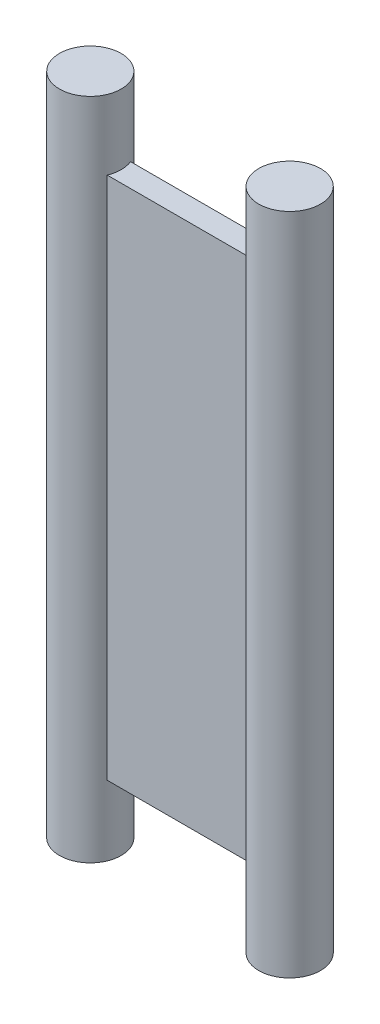
ISO-10303-21;
HEADER;
FILE_DESCRIPTION(('STEP AP214'),'2;1');
FILE_NAME('part.step','',(''),(''),'','','');
FILE_SCHEMA(('AUTOMOTIVE_DESIGN { 1 0 10303 214 1 1 1 1 }'));
ENDSEC;
DATA;
#1=APPLICATION_CONTEXT('core data for automotive mechanical design processes');
#2=APPLICATION_PROTOCOL_DEFINITION('international standard','automotive_design',2000,#1);
#3=PRODUCT_CONTEXT('',#1,'mechanical');
#4=PRODUCT('Part','Part','',(#3));
#5=PRODUCT_RELATED_PRODUCT_CATEGORY('part','',(#4));
#6=PRODUCT_DEFINITION_FORMATION('','',#4);
#7=PRODUCT_DEFINITION_CONTEXT('part definition',#1,'design');
#8=PRODUCT_DEFINITION('design','',#6,#7);
#9=PRODUCT_DEFINITION_SHAPE('','',#8);
#10=(LENGTH_UNIT() NAMED_UNIT(*) SI_UNIT(.MILLI.,.METRE.));
#11=(NAMED_UNIT(*) PLANE_ANGLE_UNIT() SI_UNIT($,.RADIAN.));
#12=(NAMED_UNIT(*) SI_UNIT($,.STERADIAN.) SOLID_ANGLE_UNIT());
#13=UNCERTAINTY_MEASURE_WITH_UNIT(LENGTH_MEASURE(1.E-05),#10,'distance_accuracy_value','');
#14=(GEOMETRIC_REPRESENTATION_CONTEXT(3) GLOBAL_UNCERTAINTY_ASSIGNED_CONTEXT((#13)) GLOBAL_UNIT_ASSIGNED_CONTEXT((#10,
#11,#12)) REPRESENTATION_CONTEXT('',''));
#15=CARTESIAN_POINT('',(0.,0.,0.));
#16=DIRECTION('',(0.,0.,1.));
#17=DIRECTION('',(1.,0.,0.));
#18=AXIS2_PLACEMENT_3D('',#15,#16,#17);
#19=CARTESIAN_POINT('',(4.279,22.5,0.499999999999999));
#20=DIRECTION('',(0.,0.,-1.));
#21=DIRECTION('',(-1.,0.,0.));
#22=AXIS2_PLACEMENT_3D('',#19,#20,#21);
#23=PLANE('',#22);
#24=DIRECTION('',(0.,-1.,0.));
#25=VECTOR('',#24,1.);
#26=CARTESIAN_POINT('',(3.0519608808192,25.5,0.499999999999999));
#27=LINE('',#26,#25);
#28=CARTESIAN_POINT('',(3.0519608808192,22.5,0.499999999999999));
#29=VERTEX_POINT('',#28);
#30=CARTESIAN_POINT('',(3.0519608808192,0.,0.5));
#31=VERTEX_POINT('',#30);
#32=EDGE_CURVE('E51',#29,#31,#27,.T.);
#33=ORIENTED_EDGE('',*,*,#32,.F.);
#34=DIRECTION('',(1.,0.,0.));
#35=VECTOR('',#34,1.);
#36=CARTESIAN_POINT('',(4.279,22.5,0.499999999999999));
#37=LINE('',#36,#35);
#38=CARTESIAN_POINT('',(-3.0519608808192,22.5,0.5));
#39=VERTEX_POINT('',#38);
#40=EDGE_CURVE('E88',#39,#29,#37,.T.);
#41=ORIENTED_EDGE('',*,*,#40,.F.);
#42=DIRECTION('',(0.,-1.,0.));
#43=VECTOR('',#42,1.);
#44=CARTESIAN_POINT('',(-3.0519608808192,25.5,0.5));
#45=LINE('',#44,#43);
#46=CARTESIAN_POINT('',(-3.0519608808192,0.,0.5));
#47=VERTEX_POINT('',#46);
#48=EDGE_CURVE('E101',#47,#39,#45,.F.);
#49=ORIENTED_EDGE('',*,*,#48,.F.);
#50=DIRECTION('',(1.,0.,0.));
#51=VECTOR('',#50,1.);
#52=CARTESIAN_POINT('',(4.279,0.,0.499999999999999));
#53=LINE('',#52,#51);
#54=EDGE_CURVE('E89',#47,#31,#53,.T.);
#55=ORIENTED_EDGE('',*,*,#54,.T.);
#56=EDGE_LOOP('',(#33,#41,#49,#55));
#57=FACE_BOUND('',#56,.T.);
#58=ADVANCED_FACE('F37',(#57),#23,.F.);
#59=CARTESIAN_POINT('',(4.279,22.5,-0.500000000000001));
#60=DIRECTION('',(0.,0.,1.));
#61=DIRECTION('',(1.,0.,0.));
#62=AXIS2_PLACEMENT_3D('',#59,#60,#61);
#63=PLANE('',#62);
#64=DIRECTION('',(0.,-1.,0.));
#65=VECTOR('',#64,1.);
#66=CARTESIAN_POINT('',(3.0519608808192,25.5,-0.5));
#67=LINE('',#66,#65);
#68=CARTESIAN_POINT('',(3.0519608808192,0.,-0.5));
#69=VERTEX_POINT('',#68);
#70=CARTESIAN_POINT('',(3.0519608808192,22.5,-0.5));
#71=VERTEX_POINT('',#70);
#72=EDGE_CURVE('E76',#69,#71,#67,.F.);
#73=ORIENTED_EDGE('',*,*,#72,.F.);
#74=DIRECTION('',(-1.,0.,0.));
#75=VECTOR('',#74,1.);
#76=CARTESIAN_POINT('',(4.279,0.,-0.500000000000001));
#77=LINE('',#76,#75);
#78=CARTESIAN_POINT('',(-3.0519608808192,0.,-0.5));
#79=VERTEX_POINT('',#78);
#80=EDGE_CURVE('E58',#69,#79,#77,.T.);
#81=ORIENTED_EDGE('',*,*,#80,.T.);
#82=DIRECTION('',(0.,-1.,0.));
#83=VECTOR('',#82,1.);
#84=CARTESIAN_POINT('',(-3.0519608808192,25.5,-0.499999999999999));
#85=LINE('',#84,#83);
#86=CARTESIAN_POINT('',(-3.0519608808192,22.5,-0.499999999999999));
#87=VERTEX_POINT('',#86);
#88=EDGE_CURVE('E103',#87,#79,#85,.T.);
#89=ORIENTED_EDGE('',*,*,#88,.F.);
#90=DIRECTION('',(-1.,0.,0.));
#91=VECTOR('',#90,1.);
#92=CARTESIAN_POINT('',(4.279,22.5,-0.500000000000001));
#93=LINE('',#92,#91);
#94=EDGE_CURVE('E83',#71,#87,#93,.T.);
#95=ORIENTED_EDGE('',*,*,#94,.F.);
#96=EDGE_LOOP('',(#73,#81,#89,#95));
#97=FACE_BOUND('',#96,.T.);
#98=ADVANCED_FACE('F82',(#97),#63,.F.);
#99=CARTESIAN_POINT('',(-4.279,25.5,0.));
#100=DIRECTION('',(0.,-1.,0.));
#101=DIRECTION('',(0.,0.,-1.));
#102=AXIS2_PLACEMENT_3D('',#99,#100,#101);
#103=CYLINDRICAL_SURFACE('',#102,1.325);
#104=CARTESIAN_POINT('',(-4.279,25.5,0.));
#105=DIRECTION('',(0.,1.,0.));
#106=DIRECTION('',(0.,0.,1.));
#107=AXIS2_PLACEMENT_3D('',#104,#105,#106);
#108=CIRCLE('',#107,1.325);
#109=CARTESIAN_POINT('',(-4.279,25.5,1.325));
#110=VERTEX_POINT('',#109);
#111=EDGE_CURVE('E105',#110,#110,#108,.T.);
#112=ORIENTED_EDGE('',*,*,#111,.F.);
#113=EDGE_LOOP('',(#112));
#114=FACE_BOUND('',#113,.T.);
#115=CARTESIAN_POINT('',(-4.279,-3.,0.));
#116=DIRECTION('',(0.,1.,0.));
#117=DIRECTION('',(0.,0.,1.));
#118=AXIS2_PLACEMENT_3D('',#115,#116,#117);
#119=CIRCLE('',#118,1.325);
#120=CARTESIAN_POINT('',(-4.279,-3.,1.325));
#121=VERTEX_POINT('',#120);
#122=EDGE_CURVE('E106',#121,#121,#119,.T.);
#123=ORIENTED_EDGE('',*,*,#122,.T.);
#124=EDGE_LOOP('',(#123));
#125=FACE_BOUND('',#124,.T.);
#126=ORIENTED_EDGE('',*,*,#48,.T.);
#127=CARTESIAN_POINT('',(-4.279,22.5,0.));
#128=DIRECTION('',(0.,-1.,0.));
#129=DIRECTION('',(0.,0.,-1.));
#130=AXIS2_PLACEMENT_3D('',#127,#128,#129);
#131=CIRCLE('',#130,1.325);
#132=EDGE_CURVE('E93',#39,#87,#131,.F.);
#133=ORIENTED_EDGE('',*,*,#132,.T.);
#134=ORIENTED_EDGE('',*,*,#88,.T.);
#135=CARTESIAN_POINT('',(-4.279,0.,0.));
#136=DIRECTION('',(0.,-1.,0.));
#137=DIRECTION('',(0.,0.,-1.));
#138=AXIS2_PLACEMENT_3D('',#135,#136,#137);
#139=CIRCLE('',#138,1.325);
#140=EDGE_CURVE('E44',#47,#79,#139,.F.);
#141=ORIENTED_EDGE('',*,*,#140,.F.);
#142=EDGE_LOOP('',(#126,#133,#134,#141));
#143=FACE_BOUND('',#142,.T.);
#144=ADVANCED_FACE('F136',(#114,#125,#143),#103,.T.);
#145=CARTESIAN_POINT('',(-4.279,25.5,0.));
#146=DIRECTION('',(0.,1.,0.));
#147=DIRECTION('',(0.,0.,1.));
#148=AXIS2_PLACEMENT_3D('',#145,#146,#147);
#149=PLANE('',#148);
#150=ORIENTED_EDGE('',*,*,#111,.T.);
#151=EDGE_LOOP('',(#150));
#152=FACE_BOUND('',#151,.T.);
#153=ADVANCED_FACE('F142',(#152),#149,.T.);
#154=CARTESIAN_POINT('',(-4.279,-3.,0.));
#155=DIRECTION('',(0.,1.,0.));
#156=DIRECTION('',(0.,0.,1.));
#157=AXIS2_PLACEMENT_3D('',#154,#155,#156);
#158=PLANE('',#157);
#159=ORIENTED_EDGE('',*,*,#122,.F.);
#160=EDGE_LOOP('',(#159));
#161=FACE_BOUND('',#160,.T.);
#162=ADVANCED_FACE('F148',(#161),#158,.F.);
#163=CARTESIAN_POINT('',(0.,22.5,0.));
#164=DIRECTION('',(0.,-1.,0.));
#165=DIRECTION('',(0.,0.,-1.));
#166=AXIS2_PLACEMENT_3D('',#163,#164,#165);
#167=PLANE('',#166);
#168=CARTESIAN_POINT('',(4.279,22.5,0.));
#169=DIRECTION('',(0.,-1.,0.));
#170=DIRECTION('',(0.,0.,-1.));
#171=AXIS2_PLACEMENT_3D('',#168,#169,#170);
#172=CIRCLE('',#171,1.325);
#173=EDGE_CURVE('E109',#71,#29,#172,.F.);
#174=ORIENTED_EDGE('',*,*,#173,.F.);
#175=ORIENTED_EDGE('',*,*,#94,.T.);
#176=ORIENTED_EDGE('',*,*,#132,.F.);
#177=ORIENTED_EDGE('',*,*,#40,.T.);
#178=EDGE_LOOP('',(#174,#175,#176,#177));
#179=FACE_BOUND('',#178,.T.);
#180=ADVANCED_FACE('F139',(#179),#167,.F.);
#181=CARTESIAN_POINT('',(0.,0.,0.));
#182=DIRECTION('',(0.,-1.,0.));
#183=DIRECTION('',(0.,0.,-1.));
#184=AXIS2_PLACEMENT_3D('',#181,#182,#183);
#185=PLANE('',#184);
#186=ORIENTED_EDGE('',*,*,#80,.F.);
#187=CARTESIAN_POINT('',(4.279,0.,0.));
#188=DIRECTION('',(0.,-1.,0.));
#189=DIRECTION('',(0.,0.,-1.));
#190=AXIS2_PLACEMENT_3D('',#187,#188,#189);
#191=CIRCLE('',#190,1.325);
#192=EDGE_CURVE('E11',#69,#31,#191,.F.);
#193=ORIENTED_EDGE('',*,*,#192,.T.);
#194=ORIENTED_EDGE('',*,*,#54,.F.);
#195=ORIENTED_EDGE('',*,*,#140,.T.);
#196=EDGE_LOOP('',(#186,#193,#194,#195));
#197=FACE_BOUND('',#196,.T.);
#198=ADVANCED_FACE('F87',(#197),#185,.T.);
#199=CARTESIAN_POINT('',(4.279,25.5,0.));
#200=DIRECTION('',(0.,-1.,0.));
#201=DIRECTION('',(0.,0.,-1.));
#202=AXIS2_PLACEMENT_3D('',#199,#200,#201);
#203=CYLINDRICAL_SURFACE('',#202,1.325);
#204=CARTESIAN_POINT('',(4.279,25.5,0.));
#205=DIRECTION('',(0.,1.,0.));
#206=DIRECTION('',(0.,0.,1.));
#207=AXIS2_PLACEMENT_3D('',#204,#205,#206);
#208=CIRCLE('',#207,1.325);
#209=CARTESIAN_POINT('',(4.279,25.5,1.325));
#210=VERTEX_POINT('',#209);
#211=EDGE_CURVE('E114',#210,#210,#208,.T.);
#212=ORIENTED_EDGE('',*,*,#211,.F.);
#213=EDGE_LOOP('',(#212));
#214=FACE_BOUND('',#213,.T.);
#215=CARTESIAN_POINT('',(4.279,-3.,0.));
#216=DIRECTION('',(0.,1.,0.));
#217=DIRECTION('',(0.,0.,1.));
#218=AXIS2_PLACEMENT_3D('',#215,#216,#217);
#219=CIRCLE('',#218,1.325);
#220=CARTESIAN_POINT('',(4.279,-3.,1.325));
#221=VERTEX_POINT('',#220);
#222=EDGE_CURVE('E84',#221,#221,#219,.T.);
#223=ORIENTED_EDGE('',*,*,#222,.T.);
#224=EDGE_LOOP('',(#223));
#225=FACE_BOUND('',#224,.T.);
#226=ORIENTED_EDGE('',*,*,#72,.T.);
#227=ORIENTED_EDGE('',*,*,#173,.T.);
#228=ORIENTED_EDGE('',*,*,#32,.T.);
#229=ORIENTED_EDGE('',*,*,#192,.F.);
#230=EDGE_LOOP('',(#226,#227,#228,#229));
#231=FACE_BOUND('',#230,.T.);
#232=ADVANCED_FACE('F75',(#214,#225,#231),#203,.T.);
#233=CARTESIAN_POINT('',(4.279,25.5,0.));
#234=DIRECTION('',(0.,1.,0.));
#235=DIRECTION('',(0.,0.,1.));
#236=AXIS2_PLACEMENT_3D('',#233,#234,#235);
#237=PLANE('',#236);
#238=ORIENTED_EDGE('',*,*,#211,.T.);
#239=EDGE_LOOP('',(#238));
#240=FACE_BOUND('',#239,.T.);
#241=ADVANCED_FACE('F123',(#240),#237,.T.);
#242=CARTESIAN_POINT('',(4.279,-3.,0.));
#243=DIRECTION('',(0.,1.,0.));
#244=DIRECTION('',(0.,0.,1.));
#245=AXIS2_PLACEMENT_3D('',#242,#243,#244);
#246=PLANE('',#245);
#247=ORIENTED_EDGE('',*,*,#222,.F.);
#248=EDGE_LOOP('',(#247));
#249=FACE_BOUND('',#248,.T.);
#250=ADVANCED_FACE('F121',(#249),#246,.F.);
#251=CLOSED_SHELL('',(#58,#98,#144,#153,#162,#180,#198,#232,#241,#250));
#252=MANIFOLD_SOLID_BREP('B2',#251);
#253=ADVANCED_BREP_SHAPE_REPRESENTATION('',(#18,#252),#14);
#254=SHAPE_DEFINITION_REPRESENTATION(#9,#253);
ENDSEC;
END-ISO-10303-21;
